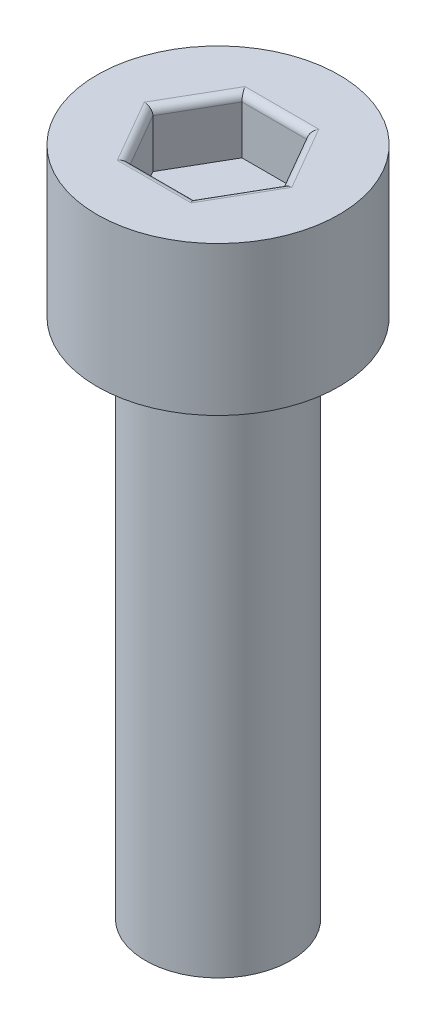
ISO-10303-21;
HEADER;
FILE_DESCRIPTION(('STEP AP214'),'2;1');
FILE_NAME('part.step','',(''),(''),'','','');
FILE_SCHEMA(('AUTOMOTIVE_DESIGN { 1 0 10303 214 1 1 1 1 }'));
ENDSEC;
DATA;
#1=APPLICATION_CONTEXT('core data for automotive mechanical design processes');
#2=APPLICATION_PROTOCOL_DEFINITION('international standard','automotive_design',2000,#1);
#3=PRODUCT_CONTEXT('',#1,'mechanical');
#4=PRODUCT('Part','Part','',(#3));
#5=PRODUCT_RELATED_PRODUCT_CATEGORY('part','',(#4));
#6=PRODUCT_DEFINITION_FORMATION('','',#4);
#7=PRODUCT_DEFINITION_CONTEXT('part definition',#1,'design');
#8=PRODUCT_DEFINITION('design','',#6,#7);
#9=PRODUCT_DEFINITION_SHAPE('','',#8);
#10=(LENGTH_UNIT() NAMED_UNIT(*) SI_UNIT(.MILLI.,.METRE.));
#11=(NAMED_UNIT(*) PLANE_ANGLE_UNIT() SI_UNIT($,.RADIAN.));
#12=(NAMED_UNIT(*) SI_UNIT($,.STERADIAN.) SOLID_ANGLE_UNIT());
#13=UNCERTAINTY_MEASURE_WITH_UNIT(LENGTH_MEASURE(1.E-05),#10,'distance_accuracy_value','');
#14=(GEOMETRIC_REPRESENTATION_CONTEXT(3) GLOBAL_UNCERTAINTY_ASSIGNED_CONTEXT((#13)) GLOBAL_UNIT_ASSIGNED_CONTEXT((#10,
#11,#12)) REPRESENTATION_CONTEXT('',''));
#15=CARTESIAN_POINT('',(0.,0.,0.));
#16=DIRECTION('',(0.,0.,1.));
#17=DIRECTION('',(1.,0.,0.));
#18=AXIS2_PLACEMENT_3D('',#15,#16,#17);
#19=CARTESIAN_POINT('',(0.,4.,0.));
#20=DIRECTION('',(0.,1.,0.));
#21=DIRECTION('',(0.,0.,1.));
#22=AXIS2_PLACEMENT_3D('',#19,#20,#21);
#23=PLANE('',#22);
#24=DIRECTION('',(0.499999999999998,0.,-0.86602540378444));
#25=VECTOR('',#24,1.);
#26=CARTESIAN_POINT('',(-1.48570508075689,4.,-0.857772228311381));
#27=LINE('',#26,#25);
#28=CARTESIAN_POINT('',(-1.98094010767585,4.,0.));
#29=VERTEX_POINT('',#28);
#30=CARTESIAN_POINT('',(-0.99047005383793,4.,-1.71554445662277));
#31=VERTEX_POINT('',#30);
#32=EDGE_CURVE('E157',#29,#31,#27,.T.);
#33=ORIENTED_EDGE('',*,*,#32,.T.);
#34=DIRECTION('',(1.,0.,0.));
#35=VECTOR('',#34,1.);
#36=CARTESIAN_POINT('',(0.,4.,-1.71554445662277));
#37=LINE('',#36,#35);
#38=CARTESIAN_POINT('',(0.990470053837918,4.,-1.71554445662277));
#39=VERTEX_POINT('',#38);
#40=EDGE_CURVE('E159',#31,#39,#37,.T.);
#41=ORIENTED_EDGE('',*,*,#40,.T.);
#42=DIRECTION('',(0.500000000000004,0.,0.866025403784436));
#43=VECTOR('',#42,1.);
#44=CARTESIAN_POINT('',(1.48570508075688,4.,-0.857772228311389));
#45=LINE('',#44,#43);
#46=CARTESIAN_POINT('',(1.98094010767585,4.,0.));
#47=VERTEX_POINT('',#46);
#48=EDGE_CURVE('E153',#39,#47,#45,.T.);
#49=ORIENTED_EDGE('',*,*,#48,.T.);
#50=DIRECTION('',(-0.499999999999998,0.,0.86602540378444));
#51=VECTOR('',#50,1.);
#52=CARTESIAN_POINT('',(1.48570508075689,4.,0.85777222831138));
#53=LINE('',#52,#51);
#54=CARTESIAN_POINT('',(0.99047005383793,4.,1.71554445662277));
#55=VERTEX_POINT('',#54);
#56=EDGE_CURVE('E149',#47,#55,#53,.T.);
#57=ORIENTED_EDGE('',*,*,#56,.T.);
#58=DIRECTION('',(-1.,0.,0.));
#59=VECTOR('',#58,1.);
#60=CARTESIAN_POINT('',(0.,4.,1.71554445662277));
#61=LINE('',#60,#59);
#62=CARTESIAN_POINT('',(-0.990470053837918,4.,1.71554445662277));
#63=VERTEX_POINT('',#62);
#64=EDGE_CURVE('E151',#55,#63,#61,.T.);
#65=ORIENTED_EDGE('',*,*,#64,.T.);
#66=DIRECTION('',(-0.500000000000004,0.,-0.866025403784436));
#67=VECTOR('',#66,1.);
#68=CARTESIAN_POINT('',(-1.48570508075688,4.,0.85777222831139));
#69=LINE('',#68,#67);
#70=EDGE_CURVE('E155',#63,#29,#69,.T.);
#71=ORIENTED_EDGE('',*,*,#70,.T.);
#72=EDGE_LOOP('',(#33,#41,#49,#57,#65,#71));
#73=FACE_BOUND('',#72,.T.);
#74=CARTESIAN_POINT('',(0.,4.,0.));
#75=DIRECTION('',(0.,1.,0.));
#76=DIRECTION('',(0.,0.,1.));
#77=AXIS2_PLACEMENT_3D('',#74,#75,#76);
#78=CIRCLE('',#77,3.25);
#79=CARTESIAN_POINT('',(0.,4.,3.25));
#80=VERTEX_POINT('',#79);
#81=EDGE_CURVE('E140',#80,#80,#78,.T.);
#82=ORIENTED_EDGE('',*,*,#81,.T.);
#83=EDGE_LOOP('',(#82));
#84=FACE_BOUND('',#83,.T.);
#85=ADVANCED_FACE('F39',(#73,#84),#23,.T.);
#86=CARTESIAN_POINT('',(0.,4.,0.));
#87=DIRECTION('',(0.,-1.,0.));
#88=DIRECTION('',(0.,0.,-1.));
#89=AXIS2_PLACEMENT_3D('',#86,#87,#88);
#90=CYLINDRICAL_SURFACE('',#89,3.25);
#91=ORIENTED_EDGE('',*,*,#81,.F.);
#92=EDGE_LOOP('',(#91));
#93=FACE_BOUND('',#92,.T.);
#94=CARTESIAN_POINT('',(0.,0.,0.));
#95=DIRECTION('',(0.,1.,0.));
#96=DIRECTION('',(0.,0.,1.));
#97=AXIS2_PLACEMENT_3D('',#94,#95,#96);
#98=CIRCLE('',#97,3.25);
#99=CARTESIAN_POINT('',(0.,0.,3.25));
#100=VERTEX_POINT('',#99);
#101=EDGE_CURVE('E136',#100,#100,#98,.T.);
#102=ORIENTED_EDGE('',*,*,#101,.T.);
#103=EDGE_LOOP('',(#102));
#104=FACE_BOUND('',#103,.T.);
#105=ADVANCED_FACE('F242',(#93,#104),#90,.T.);
#106=CARTESIAN_POINT('',(0.,0.,0.));
#107=DIRECTION('',(0.,1.,0.));
#108=DIRECTION('',(0.,0.,1.));
#109=AXIS2_PLACEMENT_3D('',#106,#107,#108);
#110=PLANE('',#109);
#111=CARTESIAN_POINT('',(0.,0.,0.));
#112=DIRECTION('',(0.,-1.,0.));
#113=DIRECTION('',(0.,0.,-1.));
#114=AXIS2_PLACEMENT_3D('',#111,#112,#113);
#115=CIRCLE('',#114,1.95);
#116=CARTESIAN_POINT('',(0.,0.,-1.95));
#117=VERTEX_POINT('',#116);
#118=EDGE_CURVE('E147',#117,#117,#115,.T.);
#119=ORIENTED_EDGE('',*,*,#118,.F.);
#120=EDGE_LOOP('',(#119));
#121=FACE_BOUND('',#120,.T.);
#122=ORIENTED_EDGE('',*,*,#101,.F.);
#123=EDGE_LOOP('',(#122));
#124=FACE_BOUND('',#123,.T.);
#125=ADVANCED_FACE('F249',(#121,#124),#110,.F.);
#126=CARTESIAN_POINT('',(-0.874999999999993,2.5,1.51554445662277));
#127=DIRECTION('',(0.866025403784436,0.,-0.500000000000004));
#128=DIRECTION('',(-0.500000000000004,0.,-0.866025403784436));
#129=AXIS2_PLACEMENT_3D('',#126,#127,#128);
#130=PLANE('',#129);
#131=DIRECTION('',(0.,1.,0.));
#132=VECTOR('',#131,1.);
#133=CARTESIAN_POINT('',(-1.75,2.5,0.));
#134=LINE('',#133,#132);
#135=CARTESIAN_POINT('',(-1.75,2.5,0.));
#136=VERTEX_POINT('',#135);
#137=CARTESIAN_POINT('',(-1.75,3.8,0.));
#138=VERTEX_POINT('',#137);
#139=EDGE_CURVE('E128',#136,#138,#134,.T.);
#140=ORIENTED_EDGE('',*,*,#139,.T.);
#141=DIRECTION('',(-0.500000000000004,0.,-0.866025403784436));
#142=VECTOR('',#141,1.);
#143=CARTESIAN_POINT('',(-0.874999999999993,3.8,1.51554445662277));
#144=LINE('',#143,#142);
#145=CARTESIAN_POINT('',(-0.874999999999993,3.8,1.51554445662277));
#146=VERTEX_POINT('',#145);
#147=EDGE_CURVE('E166',#138,#146,#144,.F.);
#148=ORIENTED_EDGE('',*,*,#147,.T.);
#149=DIRECTION('',(0.,1.,0.));
#150=VECTOR('',#149,1.);
#151=CARTESIAN_POINT('',(-0.874999999999993,2.5,1.51554445662277));
#152=LINE('',#151,#150);
#153=CARTESIAN_POINT('',(-0.874999999999993,2.5,1.51554445662277));
#154=VERTEX_POINT('',#153);
#155=EDGE_CURVE('E130',#154,#146,#152,.T.);
#156=ORIENTED_EDGE('',*,*,#155,.F.);
#157=DIRECTION('',(-0.500000000000004,0.,-0.866025403784436));
#158=VECTOR('',#157,1.);
#159=CARTESIAN_POINT('',(-0.874999999999993,2.5,1.51554445662277));
#160=LINE('',#159,#158);
#161=EDGE_CURVE('E116',#154,#136,#160,.T.);
#162=ORIENTED_EDGE('',*,*,#161,.T.);
#163=EDGE_LOOP('',(#140,#148,#156,#162));
#164=FACE_BOUND('',#163,.T.);
#165=ADVANCED_FACE('F127',(#164),#130,.T.);
#166=CARTESIAN_POINT('',(-1.75,2.5,0.));
#167=DIRECTION('',(0.86602540378444,0.,0.499999999999998));
#168=DIRECTION('',(0.499999999999998,0.,-0.86602540378444));
#169=AXIS2_PLACEMENT_3D('',#166,#167,#168);
#170=PLANE('',#169);
#171=DIRECTION('',(0.,1.,0.));
#172=VECTOR('',#171,1.);
#173=CARTESIAN_POINT('',(-0.875000000000005,2.5,-1.51554445662277));
#174=LINE('',#173,#172);
#175=CARTESIAN_POINT('',(-0.875000000000005,2.5,-1.51554445662277));
#176=VERTEX_POINT('',#175);
#177=CARTESIAN_POINT('',(-0.875000000000005,3.8,-1.51554445662277));
#178=VERTEX_POINT('',#177);
#179=EDGE_CURVE('E137',#176,#178,#174,.T.);
#180=ORIENTED_EDGE('',*,*,#179,.T.);
#181=DIRECTION('',(0.499999999999998,0.,-0.86602540378444));
#182=VECTOR('',#181,1.);
#183=CARTESIAN_POINT('',(-1.75,3.8,0.));
#184=LINE('',#183,#182);
#185=EDGE_CURVE('E135',#178,#138,#184,.F.);
#186=ORIENTED_EDGE('',*,*,#185,.T.);
#187=ORIENTED_EDGE('',*,*,#139,.F.);
#188=DIRECTION('',(0.499999999999998,0.,-0.86602540378444));
#189=VECTOR('',#188,1.);
#190=CARTESIAN_POINT('',(-1.75,2.5,0.));
#191=LINE('',#190,#189);
#192=EDGE_CURVE('E112',#136,#176,#191,.T.);
#193=ORIENTED_EDGE('',*,*,#192,.T.);
#194=EDGE_LOOP('',(#180,#186,#187,#193));
#195=FACE_BOUND('',#194,.T.);
#196=ADVANCED_FACE('F133',(#195),#170,.T.);
#197=CARTESIAN_POINT('',(-0.875000000000005,2.5,-1.51554445662277));
#198=DIRECTION('',(0.,0.,1.));
#199=DIRECTION('',(1.,0.,0.));
#200=AXIS2_PLACEMENT_3D('',#197,#198,#199);
#201=PLANE('',#200);
#202=DIRECTION('',(0.,1.,0.));
#203=VECTOR('',#202,1.);
#204=CARTESIAN_POINT('',(0.874999999999994,2.5,-1.51554445662276));
#205=LINE('',#204,#203);
#206=CARTESIAN_POINT('',(0.874999999999994,2.5,-1.51554445662276));
#207=VERTEX_POINT('',#206);
#208=CARTESIAN_POINT('',(0.874999999999994,3.8,-1.51554445662276));
#209=VERTEX_POINT('',#208);
#210=EDGE_CURVE('E142',#207,#209,#205,.T.);
#211=ORIENTED_EDGE('',*,*,#210,.T.);
#212=DIRECTION('',(1.,0.,0.));
#213=VECTOR('',#212,1.);
#214=CARTESIAN_POINT('',(-0.875000000000005,3.8,-1.51554445662277));
#215=LINE('',#214,#213);
#216=EDGE_CURVE('E162',#209,#178,#215,.F.);
#217=ORIENTED_EDGE('',*,*,#216,.T.);
#218=ORIENTED_EDGE('',*,*,#179,.F.);
#219=DIRECTION('',(1.,0.,0.));
#220=VECTOR('',#219,1.);
#221=CARTESIAN_POINT('',(-0.875000000000005,2.5,-1.51554445662277));
#222=LINE('',#221,#220);
#223=EDGE_CURVE('E118',#176,#207,#222,.T.);
#224=ORIENTED_EDGE('',*,*,#223,.T.);
#225=EDGE_LOOP('',(#211,#217,#218,#224));
#226=FACE_BOUND('',#225,.T.);
#227=ADVANCED_FACE('F211',(#226),#201,.T.);
#228=CARTESIAN_POINT('',(0.874999999999994,2.5,-1.51554445662276));
#229=DIRECTION('',(-0.866025403784436,0.,0.500000000000004));
#230=DIRECTION('',(0.500000000000004,0.,0.866025403784436));
#231=AXIS2_PLACEMENT_3D('',#228,#229,#230);
#232=PLANE('',#231);
#233=DIRECTION('',(0.,1.,0.));
#234=VECTOR('',#233,1.);
#235=CARTESIAN_POINT('',(1.75,2.5,0.));
#236=LINE('',#235,#234);
#237=CARTESIAN_POINT('',(1.75,2.5,0.));
#238=VERTEX_POINT('',#237);
#239=CARTESIAN_POINT('',(1.75,3.8,0.));
#240=VERTEX_POINT('',#239);
#241=EDGE_CURVE('E206',#238,#240,#236,.T.);
#242=ORIENTED_EDGE('',*,*,#241,.T.);
#243=DIRECTION('',(0.500000000000004,0.,0.866025403784436));
#244=VECTOR('',#243,1.);
#245=CARTESIAN_POINT('',(0.874999999999994,3.8,-1.51554445662276));
#246=LINE('',#245,#244);
#247=EDGE_CURVE('E168',#240,#209,#246,.F.);
#248=ORIENTED_EDGE('',*,*,#247,.T.);
#249=ORIENTED_EDGE('',*,*,#210,.F.);
#250=DIRECTION('',(0.500000000000004,0.,0.866025403784436));
#251=VECTOR('',#250,1.);
#252=CARTESIAN_POINT('',(0.874999999999994,2.5,-1.51554445662276));
#253=LINE('',#252,#251);
#254=EDGE_CURVE('E197',#207,#238,#253,.T.);
#255=ORIENTED_EDGE('',*,*,#254,.T.);
#256=EDGE_LOOP('',(#242,#248,#249,#255));
#257=FACE_BOUND('',#256,.T.);
#258=ADVANCED_FACE('F353',(#257),#232,.T.);
#259=CARTESIAN_POINT('',(1.75,2.5,0.));
#260=DIRECTION('',(-0.86602540378444,0.,-0.499999999999998));
#261=DIRECTION('',(-0.499999999999998,0.,0.86602540378444));
#262=AXIS2_PLACEMENT_3D('',#259,#260,#261);
#263=PLANE('',#262);
#264=DIRECTION('',(0.,1.,0.));
#265=VECTOR('',#264,1.);
#266=CARTESIAN_POINT('',(0.875000000000004,2.5,1.51554445662277));
#267=LINE('',#266,#265);
#268=CARTESIAN_POINT('',(0.875000000000004,2.5,1.51554445662277));
#269=VERTEX_POINT('',#268);
#270=CARTESIAN_POINT('',(0.875000000000004,3.8,1.51554445662277));
#271=VERTEX_POINT('',#270);
#272=EDGE_CURVE('E204',#269,#271,#267,.T.);
#273=ORIENTED_EDGE('',*,*,#272,.T.);
#274=DIRECTION('',(-0.499999999999998,0.,0.86602540378444));
#275=VECTOR('',#274,1.);
#276=CARTESIAN_POINT('',(1.75,3.8,0.));
#277=LINE('',#276,#275);
#278=EDGE_CURVE('E11',#271,#240,#277,.F.);
#279=ORIENTED_EDGE('',*,*,#278,.T.);
#280=ORIENTED_EDGE('',*,*,#241,.F.);
#281=DIRECTION('',(-0.499999999999998,0.,0.86602540378444));
#282=VECTOR('',#281,1.);
#283=CARTESIAN_POINT('',(1.75,2.5,0.));
#284=LINE('',#283,#282);
#285=EDGE_CURVE('E199',#238,#269,#284,.T.);
#286=ORIENTED_EDGE('',*,*,#285,.T.);
#287=EDGE_LOOP('',(#273,#279,#280,#286));
#288=FACE_BOUND('',#287,.T.);
#289=ADVANCED_FACE('F343',(#288),#263,.T.);
#290=CARTESIAN_POINT('',(0.875000000000004,2.5,1.51554445662277));
#291=DIRECTION('',(0.,0.,-1.));
#292=DIRECTION('',(-1.,0.,0.));
#293=AXIS2_PLACEMENT_3D('',#290,#291,#292);
#294=PLANE('',#293);
#295=ORIENTED_EDGE('',*,*,#155,.T.);
#296=DIRECTION('',(-1.,0.,0.));
#297=VECTOR('',#296,1.);
#298=CARTESIAN_POINT('',(0.875000000000004,3.8,1.51554445662277));
#299=LINE('',#298,#297);
#300=EDGE_CURVE('E48',#146,#271,#299,.F.);
#301=ORIENTED_EDGE('',*,*,#300,.T.);
#302=ORIENTED_EDGE('',*,*,#272,.F.);
#303=DIRECTION('',(-1.,0.,0.));
#304=VECTOR('',#303,1.);
#305=CARTESIAN_POINT('',(0.875000000000004,2.5,1.51554445662277));
#306=LINE('',#305,#304);
#307=EDGE_CURVE('E201',#269,#154,#306,.T.);
#308=ORIENTED_EDGE('',*,*,#307,.T.);
#309=EDGE_LOOP('',(#295,#301,#302,#308));
#310=FACE_BOUND('',#309,.T.);
#311=ADVANCED_FACE('F230',(#310),#294,.T.);
#312=CARTESIAN_POINT('',(0.,2.5,0.));
#313=DIRECTION('',(0.,-1.,0.));
#314=DIRECTION('',(0.,0.,-1.));
#315=AXIS2_PLACEMENT_3D('',#312,#313,#314);
#316=PLANE('',#315);
#317=ORIENTED_EDGE('',*,*,#161,.F.);
#318=ORIENTED_EDGE('',*,*,#307,.F.);
#319=ORIENTED_EDGE('',*,*,#285,.F.);
#320=ORIENTED_EDGE('',*,*,#254,.F.);
#321=ORIENTED_EDGE('',*,*,#223,.F.);
#322=ORIENTED_EDGE('',*,*,#192,.F.);
#323=EDGE_LOOP('',(#317,#318,#319,#320,#321,#322));
#324=FACE_BOUND('',#323,.T.);
#325=ADVANCED_FACE('F114',(#324),#316,.F.);
#326=CARTESIAN_POINT('',(0.,-14.,0.));
#327=DIRECTION('',(0.,1.,0.));
#328=DIRECTION('',(0.,0.,1.));
#329=AXIS2_PLACEMENT_3D('',#326,#327,#328);
#330=CYLINDRICAL_SURFACE('',#329,1.95);
#331=CARTESIAN_POINT('',(0.,-14.,0.));
#332=DIRECTION('',(0.,-1.,0.));
#333=DIRECTION('',(0.,0.,-1.));
#334=AXIS2_PLACEMENT_3D('',#331,#332,#333);
#335=CIRCLE('',#334,1.95);
#336=CARTESIAN_POINT('',(0.,-14.,-1.95));
#337=VERTEX_POINT('',#336);
#338=EDGE_CURVE('E131',#337,#337,#335,.T.);
#339=ORIENTED_EDGE('',*,*,#338,.F.);
#340=EDGE_LOOP('',(#339));
#341=FACE_BOUND('',#340,.T.);
#342=ORIENTED_EDGE('',*,*,#118,.T.);
#343=EDGE_LOOP('',(#342));
#344=FACE_BOUND('',#343,.T.);
#345=ADVANCED_FACE('F314',(#341,#344),#330,.T.);
#346=CARTESIAN_POINT('',(0.,-14.,0.));
#347=DIRECTION('',(0.,-1.,0.));
#348=DIRECTION('',(0.,0.,-1.));
#349=AXIS2_PLACEMENT_3D('',#346,#347,#348);
#350=PLANE('',#349);
#351=ORIENTED_EDGE('',*,*,#338,.T.);
#352=EDGE_LOOP('',(#351));
#353=FACE_BOUND('',#352,.T.);
#354=ADVANCED_FACE('F305',(#353),#350,.T.);
#355=CARTESIAN_POINT('',(0.,3.8,1.71554445662277));
#356=DIRECTION('',(-1.,0.,0.));
#357=DIRECTION('',(0.,0.,1.));
#358=AXIS2_PLACEMENT_3D('',#355,#356,#357);
#359=CYLINDRICAL_SURFACE('',#358,0.2);
#360=CARTESIAN_POINT('',(0.990470053837929,3.8,1.71554445662277));
#361=DIRECTION('',(-0.866025403784438,0.,0.500000000000001));
#362=DIRECTION('',(-0.500000000000001,0.,-0.866025403784438));
#363=AXIS2_PLACEMENT_3D('',#360,#361,#362);
#364=ELLIPSE('',#363,0.23094010767585,0.2);
#365=EDGE_CURVE('E180',#271,#55,#364,.F.);
#366=ORIENTED_EDGE('',*,*,#365,.F.);
#367=ORIENTED_EDGE('',*,*,#300,.F.);
#368=CARTESIAN_POINT('',(-0.990470053837918,3.8,1.71554445662277));
#369=DIRECTION('',(-0.86602540378444,0.,-0.499999999999998));
#370=DIRECTION('',(0.499999999999998,0.,-0.86602540378444));
#371=AXIS2_PLACEMENT_3D('',#368,#369,#370);
#372=ELLIPSE('',#371,0.23094010767585,0.2);
#373=EDGE_CURVE('E43',#63,#146,#372,.T.);
#374=ORIENTED_EDGE('',*,*,#373,.F.);
#375=ORIENTED_EDGE('',*,*,#64,.F.);
#376=EDGE_LOOP('',(#366,#367,#374,#375));
#377=FACE_BOUND('',#376,.T.);
#378=ADVANCED_FACE('F41',(#377),#359,.T.);
#379=CARTESIAN_POINT('',(-1.48570508075688,3.8,0.85777222831139));
#380=DIRECTION('',(-0.500000000000004,0.,-0.866025403784436));
#381=DIRECTION('',(-0.866025403784436,0.,0.500000000000004));
#382=AXIS2_PLACEMENT_3D('',#379,#380,#381);
#383=CYLINDRICAL_SURFACE('',#382,0.2);
#384=ORIENTED_EDGE('',*,*,#373,.T.);
#385=ORIENTED_EDGE('',*,*,#147,.F.);
#386=CARTESIAN_POINT('',(-1.98094010767585,3.8,0.));
#387=DIRECTION('',(0.,0.,-1.));
#388=DIRECTION('',(1.,0.,0.));
#389=AXIS2_PLACEMENT_3D('',#386,#387,#388);
#390=ELLIPSE('',#389,0.23094010767585,0.2);
#391=EDGE_CURVE('E178',#29,#138,#390,.T.);
#392=ORIENTED_EDGE('',*,*,#391,.F.);
#393=ORIENTED_EDGE('',*,*,#70,.F.);
#394=EDGE_LOOP('',(#384,#385,#392,#393));
#395=FACE_BOUND('',#394,.T.);
#396=ADVANCED_FACE('F229',(#395),#383,.T.);
#397=CARTESIAN_POINT('',(1.48570508075689,3.8,0.85777222831138));
#398=DIRECTION('',(-0.499999999999998,0.,0.86602540378444));
#399=DIRECTION('',(0.86602540378444,0.,0.499999999999998));
#400=AXIS2_PLACEMENT_3D('',#397,#398,#399);
#401=CYLINDRICAL_SURFACE('',#400,0.2);
#402=ORIENTED_EDGE('',*,*,#365,.T.);
#403=ORIENTED_EDGE('',*,*,#56,.F.);
#404=CARTESIAN_POINT('',(1.98094010767585,3.8,0.));
#405=DIRECTION('',(0.,0.,1.));
#406=DIRECTION('',(1.,0.,0.));
#407=AXIS2_PLACEMENT_3D('',#404,#405,#406);
#408=ELLIPSE('',#407,0.23094010767585,0.2);
#409=EDGE_CURVE('E175',#240,#47,#408,.F.);
#410=ORIENTED_EDGE('',*,*,#409,.F.);
#411=ORIENTED_EDGE('',*,*,#278,.F.);
#412=EDGE_LOOP('',(#402,#403,#410,#411));
#413=FACE_BOUND('',#412,.T.);
#414=ADVANCED_FACE('F233',(#413),#401,.T.);
#415=CARTESIAN_POINT('',(-1.48570508075689,3.8,-0.857772228311381));
#416=DIRECTION('',(0.499999999999998,0.,-0.86602540378444));
#417=DIRECTION('',(-0.86602540378444,0.,-0.499999999999998));
#418=AXIS2_PLACEMENT_3D('',#415,#416,#417);
#419=CYLINDRICAL_SURFACE('',#418,0.2);
#420=ORIENTED_EDGE('',*,*,#391,.T.);
#421=ORIENTED_EDGE('',*,*,#185,.F.);
#422=CARTESIAN_POINT('',(-0.99047005383793,3.8,-1.71554445662277));
#423=DIRECTION('',(0.866025403784438,0.,-0.500000000000001));
#424=DIRECTION('',(0.500000000000001,0.,0.866025403784438));
#425=AXIS2_PLACEMENT_3D('',#422,#423,#424);
#426=ELLIPSE('',#425,0.23094010767585,0.2);
#427=EDGE_CURVE('E173',#31,#178,#426,.T.);
#428=ORIENTED_EDGE('',*,*,#427,.F.);
#429=ORIENTED_EDGE('',*,*,#32,.F.);
#430=EDGE_LOOP('',(#420,#421,#428,#429));
#431=FACE_BOUND('',#430,.T.);
#432=ADVANCED_FACE('F228',(#431),#419,.T.);
#433=CARTESIAN_POINT('',(1.48570508075688,3.8,-0.857772228311389));
#434=DIRECTION('',(0.500000000000004,0.,0.866025403784436));
#435=DIRECTION('',(0.866025403784436,0.,-0.500000000000004));
#436=AXIS2_PLACEMENT_3D('',#433,#434,#435);
#437=CYLINDRICAL_SURFACE('',#436,0.2);
#438=ORIENTED_EDGE('',*,*,#409,.T.);
#439=ORIENTED_EDGE('',*,*,#48,.F.);
#440=CARTESIAN_POINT('',(0.990470053837918,3.8,-1.71554445662277));
#441=DIRECTION('',(0.86602540378444,0.,0.499999999999998));
#442=DIRECTION('',(0.499999999999998,0.,-0.86602540378444));
#443=AXIS2_PLACEMENT_3D('',#440,#441,#442);
#444=ELLIPSE('',#443,0.23094010767585,0.2);
#445=EDGE_CURVE('E171',#209,#39,#444,.F.);
#446=ORIENTED_EDGE('',*,*,#445,.F.);
#447=ORIENTED_EDGE('',*,*,#247,.F.);
#448=EDGE_LOOP('',(#438,#439,#446,#447));
#449=FACE_BOUND('',#448,.T.);
#450=ADVANCED_FACE('F221',(#449),#437,.T.);
#451=CARTESIAN_POINT('',(0.,3.8,-1.71554445662277));
#452=DIRECTION('',(1.,0.,0.));
#453=DIRECTION('',(0.,0.,-1.));
#454=AXIS2_PLACEMENT_3D('',#451,#452,#453);
#455=CYLINDRICAL_SURFACE('',#454,0.2);
#456=ORIENTED_EDGE('',*,*,#427,.T.);
#457=ORIENTED_EDGE('',*,*,#216,.F.);
#458=ORIENTED_EDGE('',*,*,#445,.T.);
#459=ORIENTED_EDGE('',*,*,#40,.F.);
#460=EDGE_LOOP('',(#456,#457,#458,#459));
#461=FACE_BOUND('',#460,.T.);
#462=ADVANCED_FACE('F215',(#461),#455,.T.);
#463=CLOSED_SHELL('',(#85,#105,#125,#165,#196,#227,#258,#289,#311,#325,#345,#354,#378,#396,#414,
#432,#450,#462));
#464=MANIFOLD_SOLID_BREP('B2',#463);
#465=ADVANCED_BREP_SHAPE_REPRESENTATION('',(#18,#464),#14);
#466=SHAPE_DEFINITION_REPRESENTATION(#9,#465);
ENDSEC;
END-ISO-10303-21;
